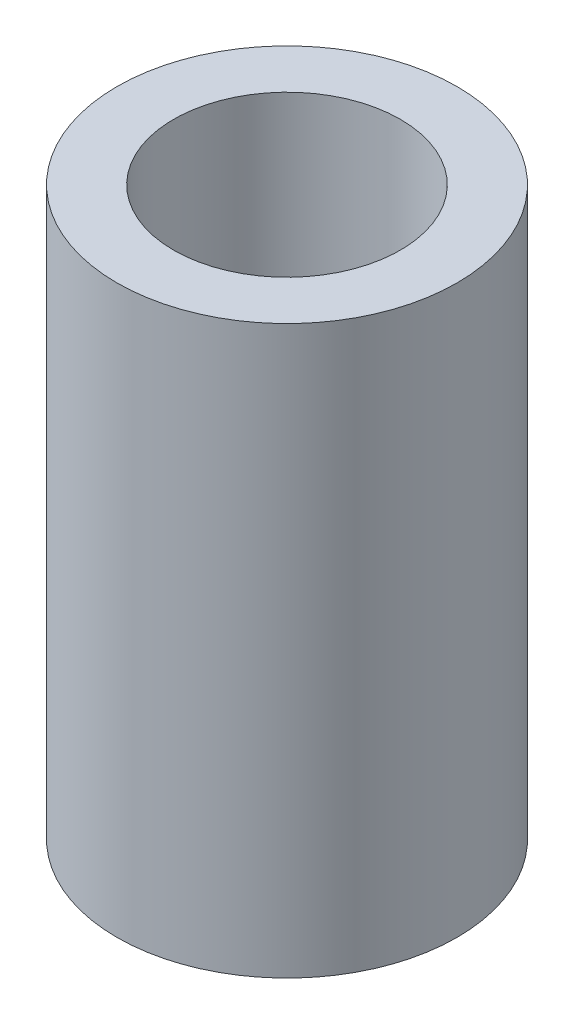
ISO-10303-21;
HEADER;
FILE_DESCRIPTION(('STEP AP214'),'2;1');
FILE_NAME('part.step','',(''),(''),'','','');
FILE_SCHEMA(('AUTOMOTIVE_DESIGN { 1 0 10303 214 1 1 1 1 }'));
ENDSEC;
DATA;
#1=APPLICATION_CONTEXT('core data for automotive mechanical design processes');
#2=APPLICATION_PROTOCOL_DEFINITION('international standard','automotive_design',2000,#1);
#3=PRODUCT_CONTEXT('',#1,'mechanical');
#4=PRODUCT('Part','Part','',(#3));
#5=PRODUCT_RELATED_PRODUCT_CATEGORY('part','',(#4));
#6=PRODUCT_DEFINITION_FORMATION('','',#4);
#7=PRODUCT_DEFINITION_CONTEXT('part definition',#1,'design');
#8=PRODUCT_DEFINITION('design','',#6,#7);
#9=PRODUCT_DEFINITION_SHAPE('','',#8);
#10=(LENGTH_UNIT() NAMED_UNIT(*) SI_UNIT(.MILLI.,.METRE.));
#11=(NAMED_UNIT(*) PLANE_ANGLE_UNIT() SI_UNIT($,.RADIAN.));
#12=(NAMED_UNIT(*) SI_UNIT($,.STERADIAN.) SOLID_ANGLE_UNIT());
#13=UNCERTAINTY_MEASURE_WITH_UNIT(LENGTH_MEASURE(1.E-05),#10,'distance_accuracy_value','');
#14=(GEOMETRIC_REPRESENTATION_CONTEXT(3) GLOBAL_UNCERTAINTY_ASSIGNED_CONTEXT((#13)) GLOBAL_UNIT_ASSIGNED_CONTEXT((#10,
#11,#12)) REPRESENTATION_CONTEXT('',''));
#15=CARTESIAN_POINT('',(0.,0.,0.));
#16=DIRECTION('',(0.,0.,1.));
#17=DIRECTION('',(1.,0.,0.));
#18=AXIS2_PLACEMENT_3D('',#15,#16,#17);
#19=CARTESIAN_POINT('',(0.,15.875,0.));
#20=DIRECTION('',(0.,1.,0.));
#21=DIRECTION('',(0.,0.,1.));
#22=AXIS2_PLACEMENT_3D('',#19,#20,#21);
#23=PLANE('',#22);
#24=CARTESIAN_POINT('',(0.,15.875,0.));
#25=DIRECTION('',(0.,1.,0.));
#26=DIRECTION('',(0.,0.,1.));
#27=AXIS2_PLACEMENT_3D('',#24,#25,#26);
#28=CIRCLE('',#27,4.7625);
#29=CARTESIAN_POINT('',(0.,15.875,4.7625));
#30=VERTEX_POINT('',#29);
#31=EDGE_CURVE('E10',#30,#30,#28,.T.);
#32=ORIENTED_EDGE('',*,*,#31,.T.);
#33=EDGE_LOOP('',(#32));
#34=FACE_BOUND('',#33,.T.);
#35=CARTESIAN_POINT('',(0.,15.875,0.));
#36=DIRECTION('',(0.,1.,0.));
#37=DIRECTION('',(0.,0.,1.));
#38=AXIS2_PLACEMENT_3D('',#35,#36,#37);
#39=CIRCLE('',#38,3.175);
#40=CARTESIAN_POINT('',(0.,15.875,3.175));
#41=VERTEX_POINT('',#40);
#42=EDGE_CURVE('E56',#41,#41,#39,.T.);
#43=ORIENTED_EDGE('',*,*,#42,.F.);
#44=EDGE_LOOP('',(#43));
#45=FACE_BOUND('',#44,.T.);
#46=ADVANCED_FACE('F43',(#34,#45),#23,.T.);
#47=CARTESIAN_POINT('',(0.,0.,0.));
#48=DIRECTION('',(0.,1.,0.));
#49=DIRECTION('',(0.,0.,1.));
#50=AXIS2_PLACEMENT_3D('',#47,#48,#49);
#51=PLANE('',#50);
#52=CARTESIAN_POINT('',(0.,0.,0.));
#53=DIRECTION('',(0.,1.,0.));
#54=DIRECTION('',(0.,0.,1.));
#55=AXIS2_PLACEMENT_3D('',#52,#53,#54);
#56=CIRCLE('',#55,4.7625);
#57=CARTESIAN_POINT('',(0.,0.,4.7625));
#58=VERTEX_POINT('',#57);
#59=EDGE_CURVE('E47',#58,#58,#56,.T.);
#60=ORIENTED_EDGE('',*,*,#59,.F.);
#61=EDGE_LOOP('',(#60));
#62=FACE_BOUND('',#61,.T.);
#63=CARTESIAN_POINT('',(0.,0.,0.));
#64=DIRECTION('',(0.,1.,0.));
#65=DIRECTION('',(0.,0.,1.));
#66=AXIS2_PLACEMENT_3D('',#63,#64,#65);
#67=CIRCLE('',#66,3.175);
#68=CARTESIAN_POINT('',(0.,0.,3.175));
#69=VERTEX_POINT('',#68);
#70=EDGE_CURVE('E58',#69,#69,#67,.T.);
#71=ORIENTED_EDGE('',*,*,#70,.T.);
#72=EDGE_LOOP('',(#71));
#73=FACE_BOUND('',#72,.T.);
#74=ADVANCED_FACE('F70',(#62,#73),#51,.F.);
#75=CARTESIAN_POINT('',(0.,15.875,0.));
#76=DIRECTION('',(0.,-1.,0.));
#77=DIRECTION('',(0.,0.,-1.));
#78=AXIS2_PLACEMENT_3D('',#75,#76,#77);
#79=CYLINDRICAL_SURFACE('',#78,4.7625);
#80=ORIENTED_EDGE('',*,*,#31,.F.);
#81=EDGE_LOOP('',(#80));
#82=FACE_BOUND('',#81,.T.);
#83=ORIENTED_EDGE('',*,*,#59,.T.);
#84=EDGE_LOOP('',(#83));
#85=FACE_BOUND('',#84,.T.);
#86=ADVANCED_FACE('F45',(#82,#85),#79,.T.);
#87=CARTESIAN_POINT('',(0.,15.875,0.));
#88=DIRECTION('',(0.,-1.,0.));
#89=DIRECTION('',(0.,0.,-1.));
#90=AXIS2_PLACEMENT_3D('',#87,#88,#89);
#91=CYLINDRICAL_SURFACE('',#90,3.175);
#92=ORIENTED_EDGE('',*,*,#42,.T.);
#93=EDGE_LOOP('',(#92));
#94=FACE_BOUND('',#93,.T.);
#95=ORIENTED_EDGE('',*,*,#70,.F.);
#96=EDGE_LOOP('',(#95));
#97=FACE_BOUND('',#96,.T.);
#98=ADVANCED_FACE('F66',(#94,#97),#91,.F.);
#99=CLOSED_SHELL('',(#46,#74,#86,#98));
#100=MANIFOLD_SOLID_BREP('B2',#99);
#101=ADVANCED_BREP_SHAPE_REPRESENTATION('',(#18,#100),#14);
#102=SHAPE_DEFINITION_REPRESENTATION(#9,#101);
ENDSEC;
END-ISO-10303-21;
